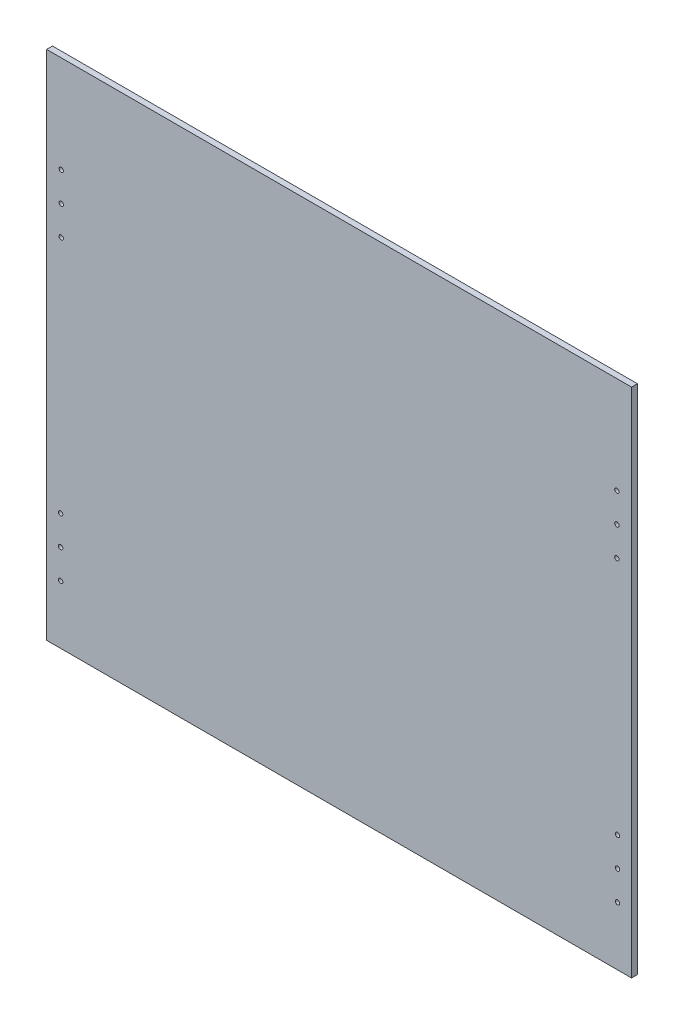
ISO-10303-21;
HEADER;
FILE_DESCRIPTION(('STEP AP214'),'2;1');
FILE_NAME('part.step','',(''),(''),'','','');
FILE_SCHEMA(('AUTOMOTIVE_DESIGN { 1 0 10303 214 1 1 1 1 }'));
ENDSEC;
DATA;
#1=APPLICATION_CONTEXT('core data for automotive mechanical design processes');
#2=APPLICATION_PROTOCOL_DEFINITION('international standard','automotive_design',2000,#1);
#3=PRODUCT_CONTEXT('',#1,'mechanical');
#4=PRODUCT('Part','Part','',(#3));
#5=PRODUCT_RELATED_PRODUCT_CATEGORY('part','',(#4));
#6=PRODUCT_DEFINITION_FORMATION('','',#4);
#7=PRODUCT_DEFINITION_CONTEXT('part definition',#1,'design');
#8=PRODUCT_DEFINITION('design','',#6,#7);
#9=PRODUCT_DEFINITION_SHAPE('','',#8);
#10=(LENGTH_UNIT() NAMED_UNIT(*) SI_UNIT(.MILLI.,.METRE.));
#11=(NAMED_UNIT(*) PLANE_ANGLE_UNIT() SI_UNIT($,.RADIAN.));
#12=(NAMED_UNIT(*) SI_UNIT($,.STERADIAN.) SOLID_ANGLE_UNIT());
#13=UNCERTAINTY_MEASURE_WITH_UNIT(LENGTH_MEASURE(1.E-05),#10,'distance_accuracy_value','');
#14=(GEOMETRIC_REPRESENTATION_CONTEXT(3) GLOBAL_UNCERTAINTY_ASSIGNED_CONTEXT((#13)) GLOBAL_UNIT_ASSIGNED_CONTEXT((#10,
#11,#12)) REPRESENTATION_CONTEXT('',''));
#15=CARTESIAN_POINT('',(0.,0.,0.));
#16=DIRECTION('',(0.,0.,1.));
#17=DIRECTION('',(1.,0.,0.));
#18=AXIS2_PLACEMENT_3D('',#15,#16,#17);
#19=CARTESIAN_POINT('',(0.,0.,4.));
#20=DIRECTION('',(0.,0.,1.));
#21=DIRECTION('',(1.,0.,0.));
#22=AXIS2_PLACEMENT_3D('',#19,#20,#21);
#23=PLANE('',#22);
#24=CARTESIAN_POINT('',(-190.,88.62,4.));
#25=DIRECTION('',(0.,0.,1.));
#26=DIRECTION('',(-1.,0.,0.));
#27=AXIS2_PLACEMENT_3D('',#24,#25,#26);
#28=CIRCLE('',#27,1.5);
#29=CARTESIAN_POINT('',(-191.5,88.62,4.));
#30=VERTEX_POINT('',#29);
#31=EDGE_CURVE('E212',#30,#30,#28,.T.);
#32=ORIENTED_EDGE('',*,*,#31,.F.);
#33=EDGE_LOOP('',(#32));
#34=FACE_BOUND('',#33,.T.);
#35=CARTESIAN_POINT('',(190.,88.62,4.));
#36=DIRECTION('',(0.,0.,1.));
#37=DIRECTION('',(1.,0.,0.));
#38=AXIS2_PLACEMENT_3D('',#35,#36,#37);
#39=CIRCLE('',#38,1.5);
#40=CARTESIAN_POINT('',(191.5,88.62,4.));
#41=VERTEX_POINT('',#40);
#42=EDGE_CURVE('E196',#41,#41,#39,.T.);
#43=ORIENTED_EDGE('',*,*,#42,.F.);
#44=EDGE_LOOP('',(#43));
#45=FACE_BOUND('',#44,.T.);
#46=CARTESIAN_POINT('',(190.,68.62,4.));
#47=DIRECTION('',(0.,0.,1.));
#48=DIRECTION('',(1.,0.,0.));
#49=AXIS2_PLACEMENT_3D('',#46,#47,#48);
#50=CIRCLE('',#49,1.5);
#51=CARTESIAN_POINT('',(191.5,68.62,4.));
#52=VERTEX_POINT('',#51);
#53=EDGE_CURVE('E180',#52,#52,#50,.T.);
#54=ORIENTED_EDGE('',*,*,#53,.F.);
#55=EDGE_LOOP('',(#54));
#56=FACE_BOUND('',#55,.T.);
#57=CARTESIAN_POINT('',(190.420210885856,-95.,4.));
#58=DIRECTION('',(0.,0.,1.));
#59=DIRECTION('',(1.,0.,0.));
#60=AXIS2_PLACEMENT_3D('',#57,#58,#59);
#61=CIRCLE('',#60,1.5);
#62=CARTESIAN_POINT('',(191.920210885856,-95.,4.));
#63=VERTEX_POINT('',#62);
#64=EDGE_CURVE('E164',#63,#63,#61,.T.);
#65=ORIENTED_EDGE('',*,*,#64,.F.);
#66=EDGE_LOOP('',(#65));
#67=FACE_BOUND('',#66,.T.);
#68=CARTESIAN_POINT('',(-190.420210885856,-95.,4.));
#69=DIRECTION('',(0.,0.,1.));
#70=DIRECTION('',(-1.,0.,0.));
#71=AXIS2_PLACEMENT_3D('',#68,#69,#70);
#72=CIRCLE('',#71,1.5);
#73=CARTESIAN_POINT('',(-191.920210885856,-95.,4.));
#74=VERTEX_POINT('',#73);
#75=EDGE_CURVE('E148',#74,#74,#72,.T.);
#76=ORIENTED_EDGE('',*,*,#75,.F.);
#77=EDGE_LOOP('',(#76));
#78=FACE_BOUND('',#77,.T.);
#79=CARTESIAN_POINT('',(-190.420210885856,-135.,4.));
#80=DIRECTION('',(0.,0.,1.));
#81=DIRECTION('',(-1.,0.,0.));
#82=AXIS2_PLACEMENT_3D('',#79,#80,#81);
#83=CIRCLE('',#82,1.5);
#84=CARTESIAN_POINT('',(-191.920210885856,-135.,4.));
#85=VERTEX_POINT('',#84);
#86=EDGE_CURVE('E118',#85,#85,#83,.T.);
#87=ORIENTED_EDGE('',*,*,#86,.F.);
#88=EDGE_LOOP('',(#87));
#89=FACE_BOUND('',#88,.T.);
#90=DIRECTION('',(0.,1.,0.));
#91=VECTOR('',#90,1.);
#92=CARTESIAN_POINT('',(200.,175.,4.));
#93=LINE('',#92,#91);
#94=CARTESIAN_POINT('',(200.,-175.,4.));
#95=VERTEX_POINT('',#94);
#96=CARTESIAN_POINT('',(200.,175.,4.));
#97=VERTEX_POINT('',#96);
#98=EDGE_CURVE('E98',#95,#97,#93,.T.);
#99=ORIENTED_EDGE('',*,*,#98,.T.);
#100=DIRECTION('',(-1.,0.,0.));
#101=VECTOR('',#100,1.);
#102=CARTESIAN_POINT('',(-200.,175.,4.));
#103=LINE('',#102,#101);
#104=CARTESIAN_POINT('',(-200.,175.,4.));
#105=VERTEX_POINT('',#104);
#106=EDGE_CURVE('E93',#97,#105,#103,.T.);
#107=ORIENTED_EDGE('',*,*,#106,.T.);
#108=DIRECTION('',(0.,-1.,0.));
#109=VECTOR('',#108,1.);
#110=CARTESIAN_POINT('',(-200.,175.,4.));
#111=LINE('',#110,#109);
#112=CARTESIAN_POINT('',(-200.,-175.,4.));
#113=VERTEX_POINT('',#112);
#114=EDGE_CURVE('E96',#105,#113,#111,.T.);
#115=ORIENTED_EDGE('',*,*,#114,.T.);
#116=DIRECTION('',(1.,0.,0.));
#117=VECTOR('',#116,1.);
#118=CARTESIAN_POINT('',(-200.,-175.,4.));
#119=LINE('',#118,#117);
#120=EDGE_CURVE('E63',#113,#95,#119,.T.);
#121=ORIENTED_EDGE('',*,*,#120,.T.);
#122=EDGE_LOOP('',(#99,#107,#115,#121));
#123=FACE_BOUND('',#122,.T.);
#124=CARTESIAN_POINT('',(190.420210885856,-135.,4.));
#125=DIRECTION('',(0.,0.,1.));
#126=DIRECTION('',(1.,0.,0.));
#127=AXIS2_PLACEMENT_3D('',#124,#125,#126);
#128=CIRCLE('',#127,1.5);
#129=CARTESIAN_POINT('',(191.920210885856,-135.,4.));
#130=VERTEX_POINT('',#129);
#131=EDGE_CURVE('E140',#130,#130,#128,.T.);
#132=ORIENTED_EDGE('',*,*,#131,.F.);
#133=EDGE_LOOP('',(#132));
#134=FACE_BOUND('',#133,.T.);
#135=CARTESIAN_POINT('',(190.420210885856,-115.,4.));
#136=DIRECTION('',(0.,0.,1.));
#137=DIRECTION('',(1.,0.,0.));
#138=AXIS2_PLACEMENT_3D('',#135,#136,#137);
#139=CIRCLE('',#138,1.5);
#140=CARTESIAN_POINT('',(191.920210885856,-115.,4.));
#141=VERTEX_POINT('',#140);
#142=EDGE_CURVE('E156',#141,#141,#139,.T.);
#143=ORIENTED_EDGE('',*,*,#142,.F.);
#144=EDGE_LOOP('',(#143));
#145=FACE_BOUND('',#144,.T.);
#146=CARTESIAN_POINT('',(-190.420210885856,-115.,4.));
#147=DIRECTION('',(0.,0.,1.));
#148=DIRECTION('',(-1.,0.,0.));
#149=AXIS2_PLACEMENT_3D('',#146,#147,#148);
#150=CIRCLE('',#149,1.5);
#151=CARTESIAN_POINT('',(-191.920210885856,-115.,4.));
#152=VERTEX_POINT('',#151);
#153=EDGE_CURVE('E172',#152,#152,#150,.T.);
#154=ORIENTED_EDGE('',*,*,#153,.F.);
#155=EDGE_LOOP('',(#154));
#156=FACE_BOUND('',#155,.T.);
#157=CARTESIAN_POINT('',(-190.,68.62,4.));
#158=DIRECTION('',(0.,0.,1.));
#159=DIRECTION('',(-1.,0.,0.));
#160=AXIS2_PLACEMENT_3D('',#157,#158,#159);
#161=CIRCLE('',#160,1.5);
#162=CARTESIAN_POINT('',(-191.5,68.62,4.));
#163=VERTEX_POINT('',#162);
#164=EDGE_CURVE('E188',#163,#163,#161,.T.);
#165=ORIENTED_EDGE('',*,*,#164,.F.);
#166=EDGE_LOOP('',(#165));
#167=FACE_BOUND('',#166,.T.);
#168=CARTESIAN_POINT('',(190.,108.62,4.));
#169=DIRECTION('',(0.,0.,1.));
#170=DIRECTION('',(1.,0.,0.));
#171=AXIS2_PLACEMENT_3D('',#168,#169,#170);
#172=CIRCLE('',#171,1.5);
#173=CARTESIAN_POINT('',(191.5,108.62,4.));
#174=VERTEX_POINT('',#173);
#175=EDGE_CURVE('E204',#174,#174,#172,.T.);
#176=ORIENTED_EDGE('',*,*,#175,.F.);
#177=EDGE_LOOP('',(#176));
#178=FACE_BOUND('',#177,.T.);
#179=CARTESIAN_POINT('',(-190.,108.62,4.));
#180=DIRECTION('',(0.,0.,1.));
#181=DIRECTION('',(-1.,0.,0.));
#182=AXIS2_PLACEMENT_3D('',#179,#180,#181);
#183=CIRCLE('',#182,1.5);
#184=CARTESIAN_POINT('',(-191.5,108.62,4.));
#185=VERTEX_POINT('',#184);
#186=EDGE_CURVE('E220',#185,#185,#183,.T.);
#187=ORIENTED_EDGE('',*,*,#186,.F.);
#188=EDGE_LOOP('',(#187));
#189=FACE_BOUND('',#188,.T.);
#190=ADVANCED_FACE('F45',(#34,#45,#56,#67,#78,#89,#123,#134,#145,#156,#167,#178,#189),#23,.T.);
#191=CARTESIAN_POINT('',(0.,0.,0.));
#192=DIRECTION('',(0.,0.,1.));
#193=DIRECTION('',(1.,0.,0.));
#194=AXIS2_PLACEMENT_3D('',#191,#192,#193);
#195=PLANE('',#194);
#196=DIRECTION('',(0.,1.,0.));
#197=VECTOR('',#196,1.);
#198=CARTESIAN_POINT('',(200.,175.,0.));
#199=LINE('',#198,#197);
#200=CARTESIAN_POINT('',(200.,-175.,0.));
#201=VERTEX_POINT('',#200);
#202=CARTESIAN_POINT('',(200.,175.,0.));
#203=VERTEX_POINT('',#202);
#204=EDGE_CURVE('E114',#201,#203,#199,.T.);
#205=ORIENTED_EDGE('',*,*,#204,.F.);
#206=DIRECTION('',(1.,0.,0.));
#207=VECTOR('',#206,1.);
#208=CARTESIAN_POINT('',(-200.,-175.,0.));
#209=LINE('',#208,#207);
#210=CARTESIAN_POINT('',(-200.,-175.,0.));
#211=VERTEX_POINT('',#210);
#212=EDGE_CURVE('E86',#211,#201,#209,.T.);
#213=ORIENTED_EDGE('',*,*,#212,.F.);
#214=DIRECTION('',(0.,-1.,0.));
#215=VECTOR('',#214,1.);
#216=CARTESIAN_POINT('',(-200.,175.,0.));
#217=LINE('',#216,#215);
#218=CARTESIAN_POINT('',(-200.,175.,0.));
#219=VERTEX_POINT('',#218);
#220=EDGE_CURVE('E80',#219,#211,#217,.T.);
#221=ORIENTED_EDGE('',*,*,#220,.F.);
#222=DIRECTION('',(-1.,0.,0.));
#223=VECTOR('',#222,1.);
#224=CARTESIAN_POINT('',(-200.,175.,0.));
#225=LINE('',#224,#223);
#226=EDGE_CURVE('E103',#203,#219,#225,.T.);
#227=ORIENTED_EDGE('',*,*,#226,.F.);
#228=EDGE_LOOP('',(#205,#213,#221,#227));
#229=FACE_BOUND('',#228,.T.);
#230=CARTESIAN_POINT('',(-190.420210885856,-135.,0.));
#231=DIRECTION('',(0.,0.,1.));
#232=DIRECTION('',(-1.,0.,0.));
#233=AXIS2_PLACEMENT_3D('',#230,#231,#232);
#234=CIRCLE('',#233,1.5);
#235=CARTESIAN_POINT('',(-191.920210885856,-135.,0.));
#236=VERTEX_POINT('',#235);
#237=EDGE_CURVE('E136',#236,#236,#234,.T.);
#238=ORIENTED_EDGE('',*,*,#237,.T.);
#239=EDGE_LOOP('',(#238));
#240=FACE_BOUND('',#239,.T.);
#241=CARTESIAN_POINT('',(190.420210885856,-135.,0.));
#242=DIRECTION('',(0.,0.,1.));
#243=DIRECTION('',(1.,0.,0.));
#244=AXIS2_PLACEMENT_3D('',#241,#242,#243);
#245=CIRCLE('',#244,1.5);
#246=CARTESIAN_POINT('',(191.920210885856,-135.,0.));
#247=VERTEX_POINT('',#246);
#248=EDGE_CURVE('E144',#247,#247,#245,.T.);
#249=ORIENTED_EDGE('',*,*,#248,.T.);
#250=EDGE_LOOP('',(#249));
#251=FACE_BOUND('',#250,.T.);
#252=CARTESIAN_POINT('',(-190.420210885856,-95.,0.));
#253=DIRECTION('',(0.,0.,1.));
#254=DIRECTION('',(-1.,0.,0.));
#255=AXIS2_PLACEMENT_3D('',#252,#253,#254);
#256=CIRCLE('',#255,1.5);
#257=CARTESIAN_POINT('',(-191.920210885856,-95.,0.));
#258=VERTEX_POINT('',#257);
#259=EDGE_CURVE('E152',#258,#258,#256,.T.);
#260=ORIENTED_EDGE('',*,*,#259,.T.);
#261=EDGE_LOOP('',(#260));
#262=FACE_BOUND('',#261,.T.);
#263=CARTESIAN_POINT('',(190.420210885856,-115.,0.));
#264=DIRECTION('',(0.,0.,1.));
#265=DIRECTION('',(1.,0.,0.));
#266=AXIS2_PLACEMENT_3D('',#263,#264,#265);
#267=CIRCLE('',#266,1.5);
#268=CARTESIAN_POINT('',(191.920210885856,-115.,0.));
#269=VERTEX_POINT('',#268);
#270=EDGE_CURVE('E160',#269,#269,#267,.T.);
#271=ORIENTED_EDGE('',*,*,#270,.T.);
#272=EDGE_LOOP('',(#271));
#273=FACE_BOUND('',#272,.T.);
#274=CARTESIAN_POINT('',(190.420210885856,-95.,0.));
#275=DIRECTION('',(0.,0.,1.));
#276=DIRECTION('',(1.,0.,0.));
#277=AXIS2_PLACEMENT_3D('',#274,#275,#276);
#278=CIRCLE('',#277,1.5);
#279=CARTESIAN_POINT('',(191.920210885856,-95.,0.));
#280=VERTEX_POINT('',#279);
#281=EDGE_CURVE('E168',#280,#280,#278,.T.);
#282=ORIENTED_EDGE('',*,*,#281,.T.);
#283=EDGE_LOOP('',(#282));
#284=FACE_BOUND('',#283,.T.);
#285=CARTESIAN_POINT('',(-190.420210885856,-115.,0.));
#286=DIRECTION('',(0.,0.,1.));
#287=DIRECTION('',(-1.,0.,0.));
#288=AXIS2_PLACEMENT_3D('',#285,#286,#287);
#289=CIRCLE('',#288,1.5);
#290=CARTESIAN_POINT('',(-191.920210885856,-115.,0.));
#291=VERTEX_POINT('',#290);
#292=EDGE_CURVE('E176',#291,#291,#289,.T.);
#293=ORIENTED_EDGE('',*,*,#292,.T.);
#294=EDGE_LOOP('',(#293));
#295=FACE_BOUND('',#294,.T.);
#296=CARTESIAN_POINT('',(190.,68.62,0.));
#297=DIRECTION('',(0.,0.,1.));
#298=DIRECTION('',(1.,0.,0.));
#299=AXIS2_PLACEMENT_3D('',#296,#297,#298);
#300=CIRCLE('',#299,1.5);
#301=CARTESIAN_POINT('',(191.5,68.62,0.));
#302=VERTEX_POINT('',#301);
#303=EDGE_CURVE('E184',#302,#302,#300,.T.);
#304=ORIENTED_EDGE('',*,*,#303,.T.);
#305=EDGE_LOOP('',(#304));
#306=FACE_BOUND('',#305,.T.);
#307=CARTESIAN_POINT('',(-190.,68.62,0.));
#308=DIRECTION('',(0.,0.,1.));
#309=DIRECTION('',(-1.,0.,0.));
#310=AXIS2_PLACEMENT_3D('',#307,#308,#309);
#311=CIRCLE('',#310,1.5);
#312=CARTESIAN_POINT('',(-191.5,68.62,0.));
#313=VERTEX_POINT('',#312);
#314=EDGE_CURVE('E192',#313,#313,#311,.T.);
#315=ORIENTED_EDGE('',*,*,#314,.T.);
#316=EDGE_LOOP('',(#315));
#317=FACE_BOUND('',#316,.T.);
#318=CARTESIAN_POINT('',(190.,88.62,0.));
#319=DIRECTION('',(0.,0.,1.));
#320=DIRECTION('',(1.,0.,0.));
#321=AXIS2_PLACEMENT_3D('',#318,#319,#320);
#322=CIRCLE('',#321,1.5);
#323=CARTESIAN_POINT('',(191.5,88.62,0.));
#324=VERTEX_POINT('',#323);
#325=EDGE_CURVE('E200',#324,#324,#322,.T.);
#326=ORIENTED_EDGE('',*,*,#325,.T.);
#327=EDGE_LOOP('',(#326));
#328=FACE_BOUND('',#327,.T.);
#329=CARTESIAN_POINT('',(190.,108.62,0.));
#330=DIRECTION('',(0.,0.,1.));
#331=DIRECTION('',(1.,0.,0.));
#332=AXIS2_PLACEMENT_3D('',#329,#330,#331);
#333=CIRCLE('',#332,1.5);
#334=CARTESIAN_POINT('',(191.5,108.62,0.));
#335=VERTEX_POINT('',#334);
#336=EDGE_CURVE('E208',#335,#335,#333,.T.);
#337=ORIENTED_EDGE('',*,*,#336,.T.);
#338=EDGE_LOOP('',(#337));
#339=FACE_BOUND('',#338,.T.);
#340=CARTESIAN_POINT('',(-190.,88.62,0.));
#341=DIRECTION('',(0.,0.,1.));
#342=DIRECTION('',(-1.,0.,0.));
#343=AXIS2_PLACEMENT_3D('',#340,#341,#342);
#344=CIRCLE('',#343,1.5);
#345=CARTESIAN_POINT('',(-191.5,88.62,0.));
#346=VERTEX_POINT('',#345);
#347=EDGE_CURVE('E216',#346,#346,#344,.T.);
#348=ORIENTED_EDGE('',*,*,#347,.T.);
#349=EDGE_LOOP('',(#348));
#350=FACE_BOUND('',#349,.T.);
#351=CARTESIAN_POINT('',(-190.,108.62,0.));
#352=DIRECTION('',(0.,0.,1.));
#353=DIRECTION('',(-1.,0.,0.));
#354=AXIS2_PLACEMENT_3D('',#351,#352,#353);
#355=CIRCLE('',#354,1.5);
#356=CARTESIAN_POINT('',(-191.5,108.62,0.));
#357=VERTEX_POINT('',#356);
#358=EDGE_CURVE('E224',#357,#357,#355,.T.);
#359=ORIENTED_EDGE('',*,*,#358,.T.);
#360=EDGE_LOOP('',(#359));
#361=FACE_BOUND('',#360,.T.);
#362=ADVANCED_FACE('F131',(#229,#240,#251,#262,#273,#284,#295,#306,#317,#328,#339,#350,#361),
#195,.F.);
#363=CARTESIAN_POINT('',(200.,175.,4.));
#364=DIRECTION('',(-1.,0.,0.));
#365=DIRECTION('',(0.,-1.,0.));
#366=AXIS2_PLACEMENT_3D('',#363,#364,#365);
#367=PLANE('',#366);
#368=ORIENTED_EDGE('',*,*,#204,.T.);
#369=DIRECTION('',(0.,0.,-1.));
#370=VECTOR('',#369,1.);
#371=CARTESIAN_POINT('',(200.,175.,4.));
#372=LINE('',#371,#370);
#373=EDGE_CURVE('E11',#97,#203,#372,.T.);
#374=ORIENTED_EDGE('',*,*,#373,.F.);
#375=ORIENTED_EDGE('',*,*,#98,.F.);
#376=DIRECTION('',(0.,0.,-1.));
#377=VECTOR('',#376,1.);
#378=CARTESIAN_POINT('',(200.,-175.,4.));
#379=LINE('',#378,#377);
#380=EDGE_CURVE('E110',#95,#201,#379,.T.);
#381=ORIENTED_EDGE('',*,*,#380,.T.);
#382=EDGE_LOOP('',(#368,#374,#375,#381));
#383=FACE_BOUND('',#382,.T.);
#384=ADVANCED_FACE('F47',(#383),#367,.F.);
#385=CARTESIAN_POINT('',(-200.,175.,4.));
#386=DIRECTION('',(0.,-1.,0.));
#387=DIRECTION('',(0.,0.,-1.));
#388=AXIS2_PLACEMENT_3D('',#385,#386,#387);
#389=PLANE('',#388);
#390=ORIENTED_EDGE('',*,*,#226,.T.);
#391=DIRECTION('',(0.,0.,-1.));
#392=VECTOR('',#391,1.);
#393=CARTESIAN_POINT('',(-200.,175.,4.));
#394=LINE('',#393,#392);
#395=EDGE_CURVE('E55',#105,#219,#394,.T.);
#396=ORIENTED_EDGE('',*,*,#395,.F.);
#397=ORIENTED_EDGE('',*,*,#106,.F.);
#398=ORIENTED_EDGE('',*,*,#373,.T.);
#399=EDGE_LOOP('',(#390,#396,#397,#398));
#400=FACE_BOUND('',#399,.T.);
#401=ADVANCED_FACE('F102',(#400),#389,.F.);
#402=CARTESIAN_POINT('',(-200.,175.,4.));
#403=DIRECTION('',(1.,0.,0.));
#404=DIRECTION('',(0.,1.,0.));
#405=AXIS2_PLACEMENT_3D('',#402,#403,#404);
#406=PLANE('',#405);
#407=ORIENTED_EDGE('',*,*,#220,.T.);
#408=DIRECTION('',(0.,0.,-1.));
#409=VECTOR('',#408,1.);
#410=CARTESIAN_POINT('',(-200.,-175.,4.));
#411=LINE('',#410,#409);
#412=EDGE_CURVE('E105',#113,#211,#411,.T.);
#413=ORIENTED_EDGE('',*,*,#412,.F.);
#414=ORIENTED_EDGE('',*,*,#114,.F.);
#415=ORIENTED_EDGE('',*,*,#395,.T.);
#416=EDGE_LOOP('',(#407,#413,#414,#415));
#417=FACE_BOUND('',#416,.T.);
#418=ADVANCED_FACE('F106',(#417),#406,.F.);
#419=CARTESIAN_POINT('',(-200.,-175.,4.));
#420=DIRECTION('',(0.,1.,0.));
#421=DIRECTION('',(0.,0.,1.));
#422=AXIS2_PLACEMENT_3D('',#419,#420,#421);
#423=PLANE('',#422);
#424=ORIENTED_EDGE('',*,*,#212,.T.);
#425=ORIENTED_EDGE('',*,*,#380,.F.);
#426=ORIENTED_EDGE('',*,*,#120,.F.);
#427=ORIENTED_EDGE('',*,*,#412,.T.);
#428=EDGE_LOOP('',(#424,#425,#426,#427));
#429=FACE_BOUND('',#428,.T.);
#430=ADVANCED_FACE('F128',(#429),#423,.F.);
#431=CARTESIAN_POINT('',(-190.420210885856,-135.,4.));
#432=DIRECTION('',(0.,0.,-1.));
#433=DIRECTION('',(-1.,0.,0.));
#434=AXIS2_PLACEMENT_3D('',#431,#432,#433);
#435=CYLINDRICAL_SURFACE('',#434,1.5);
#436=ORIENTED_EDGE('',*,*,#86,.T.);
#437=EDGE_LOOP('',(#436));
#438=FACE_BOUND('',#437,.T.);
#439=ORIENTED_EDGE('',*,*,#237,.F.);
#440=EDGE_LOOP('',(#439));
#441=FACE_BOUND('',#440,.T.);
#442=ADVANCED_FACE('F245',(#438,#441),#435,.F.);
#443=CARTESIAN_POINT('',(190.420210885856,-135.,4.));
#444=DIRECTION('',(0.,0.,-1.));
#445=DIRECTION('',(-1.,0.,0.));
#446=AXIS2_PLACEMENT_3D('',#443,#444,#445);
#447=CYLINDRICAL_SURFACE('',#446,1.5);
#448=ORIENTED_EDGE('',*,*,#131,.T.);
#449=EDGE_LOOP('',(#448));
#450=FACE_BOUND('',#449,.T.);
#451=ORIENTED_EDGE('',*,*,#248,.F.);
#452=EDGE_LOOP('',(#451));
#453=FACE_BOUND('',#452,.T.);
#454=ADVANCED_FACE('F290',(#450,#453),#447,.F.);
#455=CARTESIAN_POINT('',(-190.420210885856,-95.,4.));
#456=DIRECTION('',(0.,0.,-1.));
#457=DIRECTION('',(-1.,0.,0.));
#458=AXIS2_PLACEMENT_3D('',#455,#456,#457);
#459=CYLINDRICAL_SURFACE('',#458,1.5);
#460=ORIENTED_EDGE('',*,*,#75,.T.);
#461=EDGE_LOOP('',(#460));
#462=FACE_BOUND('',#461,.T.);
#463=ORIENTED_EDGE('',*,*,#259,.F.);
#464=EDGE_LOOP('',(#463));
#465=FACE_BOUND('',#464,.T.);
#466=ADVANCED_FACE('F298',(#462,#465),#459,.F.);
#467=CARTESIAN_POINT('',(190.420210885856,-115.,4.));
#468=DIRECTION('',(0.,0.,-1.));
#469=DIRECTION('',(-1.,0.,0.));
#470=AXIS2_PLACEMENT_3D('',#467,#468,#469);
#471=CYLINDRICAL_SURFACE('',#470,1.5);
#472=ORIENTED_EDGE('',*,*,#142,.T.);
#473=EDGE_LOOP('',(#472));
#474=FACE_BOUND('',#473,.T.);
#475=ORIENTED_EDGE('',*,*,#270,.F.);
#476=EDGE_LOOP('',(#475));
#477=FACE_BOUND('',#476,.T.);
#478=ADVANCED_FACE('F306',(#474,#477),#471,.F.);
#479=CARTESIAN_POINT('',(190.420210885856,-95.,4.));
#480=DIRECTION('',(0.,0.,-1.));
#481=DIRECTION('',(-1.,0.,0.));
#482=AXIS2_PLACEMENT_3D('',#479,#480,#481);
#483=CYLINDRICAL_SURFACE('',#482,1.5);
#484=ORIENTED_EDGE('',*,*,#64,.T.);
#485=EDGE_LOOP('',(#484));
#486=FACE_BOUND('',#485,.T.);
#487=ORIENTED_EDGE('',*,*,#281,.F.);
#488=EDGE_LOOP('',(#487));
#489=FACE_BOUND('',#488,.T.);
#490=ADVANCED_FACE('F315',(#486,#489),#483,.F.);
#491=CARTESIAN_POINT('',(-190.420210885856,-115.,4.));
#492=DIRECTION('',(0.,0.,-1.));
#493=DIRECTION('',(-1.,0.,0.));
#494=AXIS2_PLACEMENT_3D('',#491,#492,#493);
#495=CYLINDRICAL_SURFACE('',#494,1.5);
#496=ORIENTED_EDGE('',*,*,#153,.T.);
#497=EDGE_LOOP('',(#496));
#498=FACE_BOUND('',#497,.T.);
#499=ORIENTED_EDGE('',*,*,#292,.F.);
#500=EDGE_LOOP('',(#499));
#501=FACE_BOUND('',#500,.T.);
#502=ADVANCED_FACE('F324',(#498,#501),#495,.F.);
#503=CARTESIAN_POINT('',(190.,68.62,4.));
#504=DIRECTION('',(0.,0.,-1.));
#505=DIRECTION('',(-1.,0.,0.));
#506=AXIS2_PLACEMENT_3D('',#503,#504,#505);
#507=CYLINDRICAL_SURFACE('',#506,1.5);
#508=ORIENTED_EDGE('',*,*,#53,.T.);
#509=EDGE_LOOP('',(#508));
#510=FACE_BOUND('',#509,.T.);
#511=ORIENTED_EDGE('',*,*,#303,.F.);
#512=EDGE_LOOP('',(#511));
#513=FACE_BOUND('',#512,.T.);
#514=ADVANCED_FACE('F333',(#510,#513),#507,.F.);
#515=CARTESIAN_POINT('',(-190.,68.62,4.));
#516=DIRECTION('',(0.,0.,-1.));
#517=DIRECTION('',(-1.,0.,0.));
#518=AXIS2_PLACEMENT_3D('',#515,#516,#517);
#519=CYLINDRICAL_SURFACE('',#518,1.5);
#520=ORIENTED_EDGE('',*,*,#164,.T.);
#521=EDGE_LOOP('',(#520));
#522=FACE_BOUND('',#521,.T.);
#523=ORIENTED_EDGE('',*,*,#314,.F.);
#524=EDGE_LOOP('',(#523));
#525=FACE_BOUND('',#524,.T.);
#526=ADVANCED_FACE('F342',(#522,#525),#519,.F.);
#527=CARTESIAN_POINT('',(190.,88.62,4.));
#528=DIRECTION('',(0.,0.,-1.));
#529=DIRECTION('',(-1.,0.,0.));
#530=AXIS2_PLACEMENT_3D('',#527,#528,#529);
#531=CYLINDRICAL_SURFACE('',#530,1.5);
#532=ORIENTED_EDGE('',*,*,#42,.T.);
#533=EDGE_LOOP('',(#532));
#534=FACE_BOUND('',#533,.T.);
#535=ORIENTED_EDGE('',*,*,#325,.F.);
#536=EDGE_LOOP('',(#535));
#537=FACE_BOUND('',#536,.T.);
#538=ADVANCED_FACE('F351',(#534,#537),#531,.F.);
#539=CARTESIAN_POINT('',(190.,108.62,4.));
#540=DIRECTION('',(0.,0.,-1.));
#541=DIRECTION('',(-1.,0.,0.));
#542=AXIS2_PLACEMENT_3D('',#539,#540,#541);
#543=CYLINDRICAL_SURFACE('',#542,1.5);
#544=ORIENTED_EDGE('',*,*,#175,.T.);
#545=EDGE_LOOP('',(#544));
#546=FACE_BOUND('',#545,.T.);
#547=ORIENTED_EDGE('',*,*,#336,.F.);
#548=EDGE_LOOP('',(#547));
#549=FACE_BOUND('',#548,.T.);
#550=ADVANCED_FACE('F360',(#546,#549),#543,.F.);
#551=CARTESIAN_POINT('',(-190.,88.62,4.));
#552=DIRECTION('',(0.,0.,-1.));
#553=DIRECTION('',(-1.,0.,0.));
#554=AXIS2_PLACEMENT_3D('',#551,#552,#553);
#555=CYLINDRICAL_SURFACE('',#554,1.5);
#556=ORIENTED_EDGE('',*,*,#31,.T.);
#557=EDGE_LOOP('',(#556));
#558=FACE_BOUND('',#557,.T.);
#559=ORIENTED_EDGE('',*,*,#347,.F.);
#560=EDGE_LOOP('',(#559));
#561=FACE_BOUND('',#560,.T.);
#562=ADVANCED_FACE('F369',(#558,#561),#555,.F.);
#563=CARTESIAN_POINT('',(-190.,108.62,4.));
#564=DIRECTION('',(0.,0.,-1.));
#565=DIRECTION('',(-1.,0.,0.));
#566=AXIS2_PLACEMENT_3D('',#563,#564,#565);
#567=CYLINDRICAL_SURFACE('',#566,1.5);
#568=ORIENTED_EDGE('',*,*,#186,.T.);
#569=EDGE_LOOP('',(#568));
#570=FACE_BOUND('',#569,.T.);
#571=ORIENTED_EDGE('',*,*,#358,.F.);
#572=EDGE_LOOP('',(#571));
#573=FACE_BOUND('',#572,.T.);
#574=ADVANCED_FACE('F232',(#570,#573),#567,.F.);
#575=CLOSED_SHELL('',(#190,#362,#384,#401,#418,#430,#442,#454,#466,#478,#490,#502,#514,#526,
#538,#550,#562,#574));
#576=MANIFOLD_SOLID_BREP('B2',#575);
#577=ADVANCED_BREP_SHAPE_REPRESENTATION('',(#18,#576),#14);
#578=SHAPE_DEFINITION_REPRESENTATION(#9,#577);
ENDSEC;
END-ISO-10303-21;
